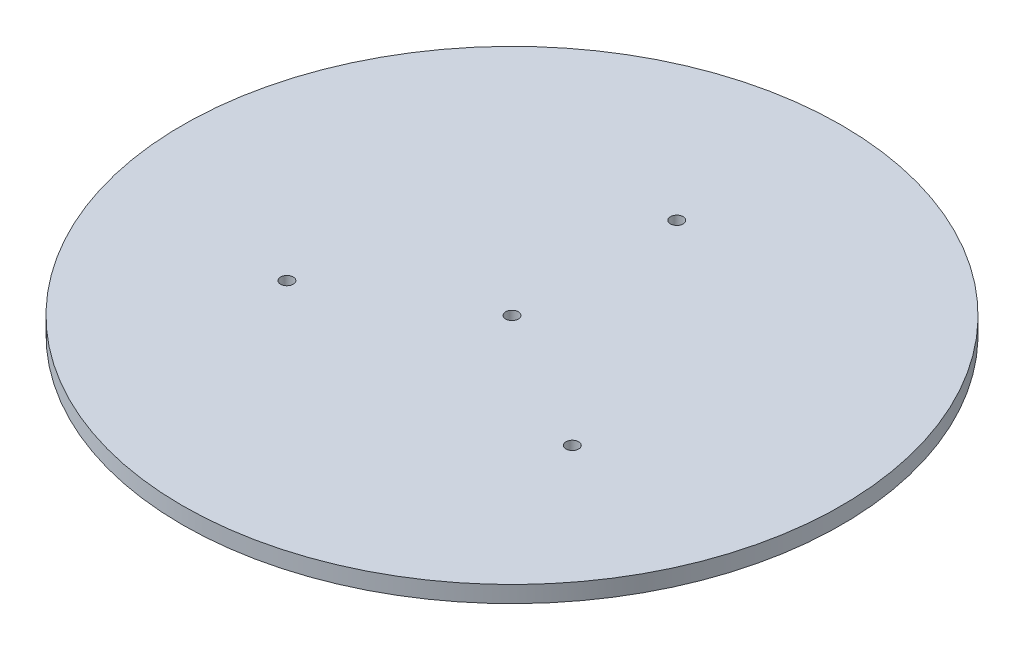
ISO-10303-21;
HEADER;
FILE_DESCRIPTION(('STEP AP214'),'2;1');
FILE_NAME('part.step','',(''),(''),'','','');
FILE_SCHEMA(('AUTOMOTIVE_DESIGN { 1 0 10303 214 1 1 1 1 }'));
ENDSEC;
DATA;
#1=APPLICATION_CONTEXT('core data for automotive mechanical design processes');
#2=APPLICATION_PROTOCOL_DEFINITION('international standard','automotive_design',2000,#1);
#3=PRODUCT_CONTEXT('',#1,'mechanical');
#4=PRODUCT('Part','Part','',(#3));
#5=PRODUCT_RELATED_PRODUCT_CATEGORY('part','',(#4));
#6=PRODUCT_DEFINITION_FORMATION('','',#4);
#7=PRODUCT_DEFINITION_CONTEXT('part definition',#1,'design');
#8=PRODUCT_DEFINITION('design','',#6,#7);
#9=PRODUCT_DEFINITION_SHAPE('','',#8);
#10=(LENGTH_UNIT() NAMED_UNIT(*) SI_UNIT(.MILLI.,.METRE.));
#11=(NAMED_UNIT(*) PLANE_ANGLE_UNIT() SI_UNIT($,.RADIAN.));
#12=(NAMED_UNIT(*) SI_UNIT($,.STERADIAN.) SOLID_ANGLE_UNIT());
#13=UNCERTAINTY_MEASURE_WITH_UNIT(LENGTH_MEASURE(1.E-05),#10,'distance_accuracy_value','');
#14=(GEOMETRIC_REPRESENTATION_CONTEXT(3) GLOBAL_UNCERTAINTY_ASSIGNED_CONTEXT((#13)) GLOBAL_UNIT_ASSIGNED_CONTEXT((#10,
#11,#12)) REPRESENTATION_CONTEXT('',''));
#15=CARTESIAN_POINT('',(0.,0.,0.));
#16=DIRECTION('',(0.,0.,1.));
#17=DIRECTION('',(1.,0.,0.));
#18=AXIS2_PLACEMENT_3D('',#15,#16,#17);
#19=CARTESIAN_POINT('',(0.,6.35,0.));
#20=DIRECTION('',(0.,1.,0.));
#21=DIRECTION('',(0.,0.,1.));
#22=AXIS2_PLACEMENT_3D('',#19,#20,#21);
#23=PLANE('',#22);
#24=CARTESIAN_POINT('',(54.6214130016148,6.35,31.5356875));
#25=DIRECTION('',(0.,1.,0.));
#26=DIRECTION('',(0.,0.,1.));
#27=AXIS2_PLACEMENT_3D('',#24,#25,#26);
#28=CIRCLE('',#27,2.4257);
#29=CARTESIAN_POINT('',(54.6214130016148,6.35,33.9613875));
#30=VERTEX_POINT('',#29);
#31=EDGE_CURVE('E53',#30,#30,#28,.T.);
#32=ORIENTED_EDGE('',*,*,#31,.F.);
#33=EDGE_LOOP('',(#32));
#34=FACE_BOUND('',#33,.T.);
#35=CARTESIAN_POINT('',(0.,6.35,-63.071375));
#36=DIRECTION('',(0.,1.,0.));
#37=DIRECTION('',(0.,0.,1.));
#38=AXIS2_PLACEMENT_3D('',#35,#36,#37);
#39=CIRCLE('',#38,2.4257);
#40=CARTESIAN_POINT('',(0.,6.35,-60.645675));
#41=VERTEX_POINT('',#40);
#42=EDGE_CURVE('E42',#41,#41,#39,.T.);
#43=ORIENTED_EDGE('',*,*,#42,.F.);
#44=EDGE_LOOP('',(#43));
#45=FACE_BOUND('',#44,.T.);
#46=CARTESIAN_POINT('',(0.,6.35,0.));
#47=DIRECTION('',(0.,1.,0.));
#48=DIRECTION('',(0.,0.,1.));
#49=AXIS2_PLACEMENT_3D('',#46,#47,#48);
#50=CIRCLE('',#49,126.14275);
#51=CARTESIAN_POINT('',(0.,6.35,126.14275));
#52=VERTEX_POINT('',#51);
#53=EDGE_CURVE('E10',#52,#52,#50,.T.);
#54=ORIENTED_EDGE('',*,*,#53,.T.);
#55=EDGE_LOOP('',(#54));
#56=FACE_BOUND('',#55,.T.);
#57=CARTESIAN_POINT('',(0.,6.35,0.));
#58=DIRECTION('',(0.,1.,0.));
#59=DIRECTION('',(0.,0.,1.));
#60=AXIS2_PLACEMENT_3D('',#57,#58,#59);
#61=CIRCLE('',#60,2.4257);
#62=CARTESIAN_POINT('',(0.,6.35,2.4257));
#63=VERTEX_POINT('',#62);
#64=EDGE_CURVE('E47',#63,#63,#61,.T.);
#65=ORIENTED_EDGE('',*,*,#64,.F.);
#66=EDGE_LOOP('',(#65));
#67=FACE_BOUND('',#66,.T.);
#68=CARTESIAN_POINT('',(-54.6214130016147,6.35,31.5356875));
#69=DIRECTION('',(0.,1.,0.));
#70=DIRECTION('',(0.,0.,1.));
#71=AXIS2_PLACEMENT_3D('',#68,#69,#70);
#72=CIRCLE('',#71,2.4257);
#73=CARTESIAN_POINT('',(-54.6214130016147,6.35,33.9613875));
#74=VERTEX_POINT('',#73);
#75=EDGE_CURVE('E59',#74,#74,#72,.T.);
#76=ORIENTED_EDGE('',*,*,#75,.F.);
#77=EDGE_LOOP('',(#76));
#78=FACE_BOUND('',#77,.T.);
#79=ADVANCED_FACE('F31',(#34,#45,#56,#67,#78),#23,.T.);
#80=CARTESIAN_POINT('',(0.,0.,0.));
#81=DIRECTION('',(0.,1.,0.));
#82=DIRECTION('',(0.,0.,1.));
#83=AXIS2_PLACEMENT_3D('',#80,#81,#82);
#84=PLANE('',#83);
#85=CARTESIAN_POINT('',(54.6214130016148,0.,31.5356875));
#86=DIRECTION('',(0.,1.,0.));
#87=DIRECTION('',(0.,0.,1.));
#88=AXIS2_PLACEMENT_3D('',#85,#86,#87);
#89=CIRCLE('',#88,2.4257);
#90=CARTESIAN_POINT('',(54.6214130016148,0.,33.9613875));
#91=VERTEX_POINT('',#90);
#92=EDGE_CURVE('E56',#91,#91,#89,.T.);
#93=ORIENTED_EDGE('',*,*,#92,.T.);
#94=EDGE_LOOP('',(#93));
#95=FACE_BOUND('',#94,.T.);
#96=CARTESIAN_POINT('',(0.,0.,-63.071375));
#97=DIRECTION('',(0.,1.,0.));
#98=DIRECTION('',(0.,0.,1.));
#99=AXIS2_PLACEMENT_3D('',#96,#97,#98);
#100=CIRCLE('',#99,2.4257);
#101=CARTESIAN_POINT('',(0.,0.,-60.645675));
#102=VERTEX_POINT('',#101);
#103=EDGE_CURVE('E44',#102,#102,#100,.T.);
#104=ORIENTED_EDGE('',*,*,#103,.T.);
#105=EDGE_LOOP('',(#104));
#106=FACE_BOUND('',#105,.T.);
#107=CARTESIAN_POINT('',(0.,0.,0.));
#108=DIRECTION('',(0.,1.,0.));
#109=DIRECTION('',(0.,0.,1.));
#110=AXIS2_PLACEMENT_3D('',#107,#108,#109);
#111=CIRCLE('',#110,126.14275);
#112=CARTESIAN_POINT('',(0.,0.,126.14275));
#113=VERTEX_POINT('',#112);
#114=EDGE_CURVE('E35',#113,#113,#111,.T.);
#115=ORIENTED_EDGE('',*,*,#114,.F.);
#116=EDGE_LOOP('',(#115));
#117=FACE_BOUND('',#116,.T.);
#118=CARTESIAN_POINT('',(0.,0.,0.));
#119=DIRECTION('',(0.,1.,0.));
#120=DIRECTION('',(0.,0.,1.));
#121=AXIS2_PLACEMENT_3D('',#118,#119,#120);
#122=CIRCLE('',#121,2.4257);
#123=CARTESIAN_POINT('',(0.,0.,2.4257));
#124=VERTEX_POINT('',#123);
#125=EDGE_CURVE('E50',#124,#124,#122,.T.);
#126=ORIENTED_EDGE('',*,*,#125,.T.);
#127=EDGE_LOOP('',(#126));
#128=FACE_BOUND('',#127,.T.);
#129=CARTESIAN_POINT('',(-54.6214130016147,0.,31.5356875));
#130=DIRECTION('',(0.,1.,0.));
#131=DIRECTION('',(0.,0.,1.));
#132=AXIS2_PLACEMENT_3D('',#129,#130,#131);
#133=CIRCLE('',#132,2.4257);
#134=CARTESIAN_POINT('',(-54.6214130016147,0.,33.9613875));
#135=VERTEX_POINT('',#134);
#136=EDGE_CURVE('E62',#135,#135,#133,.T.);
#137=ORIENTED_EDGE('',*,*,#136,.T.);
#138=EDGE_LOOP('',(#137));
#139=FACE_BOUND('',#138,.T.);
#140=ADVANCED_FACE('F72',(#95,#106,#117,#128,#139),#84,.F.);
#141=CARTESIAN_POINT('',(0.,6.35,0.));
#142=DIRECTION('',(0.,-1.,0.));
#143=DIRECTION('',(0.,0.,-1.));
#144=AXIS2_PLACEMENT_3D('',#141,#142,#143);
#145=CYLINDRICAL_SURFACE('',#144,126.14275);
#146=ORIENTED_EDGE('',*,*,#53,.F.);
#147=EDGE_LOOP('',(#146));
#148=FACE_BOUND('',#147,.T.);
#149=ORIENTED_EDGE('',*,*,#114,.T.);
#150=EDGE_LOOP('',(#149));
#151=FACE_BOUND('',#150,.T.);
#152=ADVANCED_FACE('F33',(#148,#151),#145,.T.);
#153=CARTESIAN_POINT('',(0.,6.35,-63.071375));
#154=DIRECTION('',(0.,-1.,0.));
#155=DIRECTION('',(0.,0.,-1.));
#156=AXIS2_PLACEMENT_3D('',#153,#154,#155);
#157=CYLINDRICAL_SURFACE('',#156,2.4257);
#158=ORIENTED_EDGE('',*,*,#42,.T.);
#159=EDGE_LOOP('',(#158));
#160=FACE_BOUND('',#159,.T.);
#161=ORIENTED_EDGE('',*,*,#103,.F.);
#162=EDGE_LOOP('',(#161));
#163=FACE_BOUND('',#162,.T.);
#164=ADVANCED_FACE('F82',(#160,#163),#157,.F.);
#165=CARTESIAN_POINT('',(0.,6.35,0.));
#166=DIRECTION('',(0.,-1.,0.));
#167=DIRECTION('',(0.,0.,-1.));
#168=AXIS2_PLACEMENT_3D('',#165,#166,#167);
#169=CYLINDRICAL_SURFACE('',#168,2.4257);
#170=ORIENTED_EDGE('',*,*,#64,.T.);
#171=EDGE_LOOP('',(#170));
#172=FACE_BOUND('',#171,.T.);
#173=ORIENTED_EDGE('',*,*,#125,.F.);
#174=EDGE_LOOP('',(#173));
#175=FACE_BOUND('',#174,.T.);
#176=ADVANCED_FACE('F85',(#172,#175),#169,.F.);
#177=CARTESIAN_POINT('',(54.6214130016148,6.35,31.5356875));
#178=DIRECTION('',(0.,-1.,0.));
#179=DIRECTION('',(0.,0.,-1.));
#180=AXIS2_PLACEMENT_3D('',#177,#178,#179);
#181=CYLINDRICAL_SURFACE('',#180,2.4257);
#182=ORIENTED_EDGE('',*,*,#31,.T.);
#183=EDGE_LOOP('',(#182));
#184=FACE_BOUND('',#183,.T.);
#185=ORIENTED_EDGE('',*,*,#92,.F.);
#186=EDGE_LOOP('',(#185));
#187=FACE_BOUND('',#186,.T.);
#188=ADVANCED_FACE('F89',(#184,#187),#181,.F.);
#189=CARTESIAN_POINT('',(-54.6214130016147,6.35,31.5356875));
#190=DIRECTION('',(0.,-1.,0.));
#191=DIRECTION('',(0.,0.,-1.));
#192=AXIS2_PLACEMENT_3D('',#189,#190,#191);
#193=CYLINDRICAL_SURFACE('',#192,2.4257);
#194=ORIENTED_EDGE('',*,*,#75,.T.);
#195=EDGE_LOOP('',(#194));
#196=FACE_BOUND('',#195,.T.);
#197=ORIENTED_EDGE('',*,*,#136,.F.);
#198=EDGE_LOOP('',(#197));
#199=FACE_BOUND('',#198,.T.);
#200=ADVANCED_FACE('F68',(#196,#199),#193,.F.);
#201=CLOSED_SHELL('',(#79,#140,#152,#164,#176,#188,#200));
#202=MANIFOLD_SOLID_BREP('B2',#201);
#203=ADVANCED_BREP_SHAPE_REPRESENTATION('',(#18,#202),#14);
#204=SHAPE_DEFINITION_REPRESENTATION(#9,#203);
ENDSEC;
END-ISO-10303-21;
